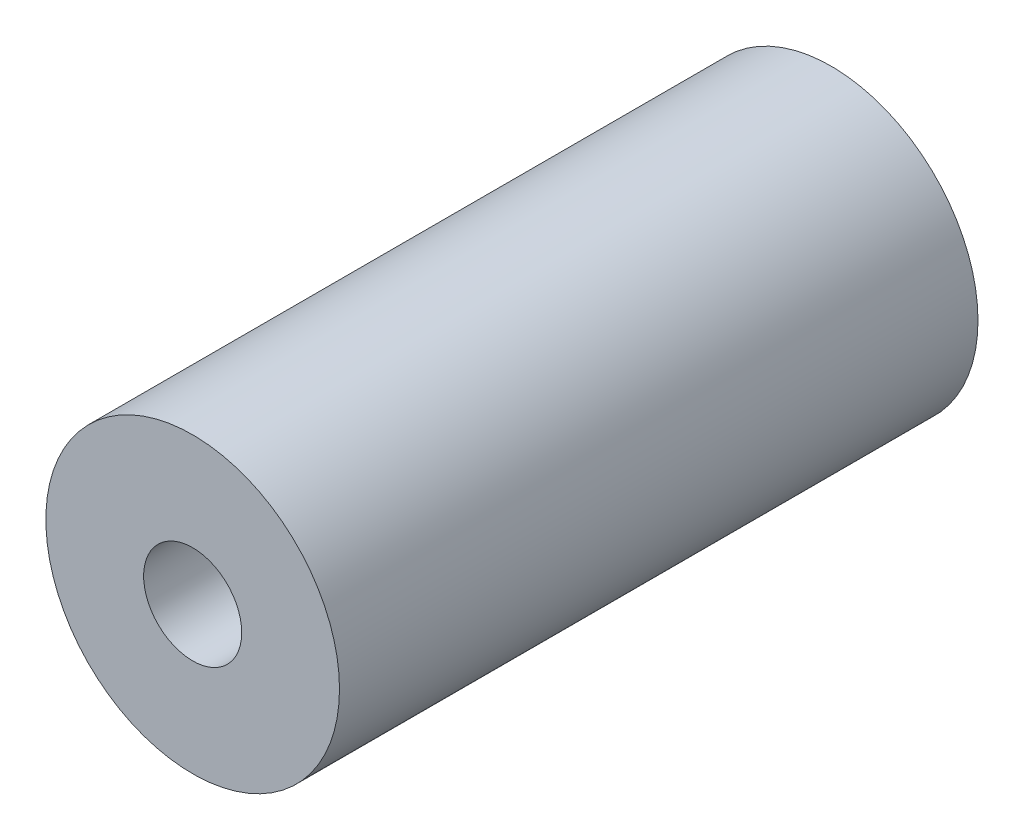
ISO-10303-21;
HEADER;
FILE_DESCRIPTION(('STEP AP214'),'2;1');
FILE_NAME('part.step','',(''),(''),'','','');
FILE_SCHEMA(('AUTOMOTIVE_DESIGN { 1 0 10303 214 1 1 1 1 }'));
ENDSEC;
DATA;
#1=APPLICATION_CONTEXT('core data for automotive mechanical design processes');
#2=APPLICATION_PROTOCOL_DEFINITION('international standard','automotive_design',2000,#1);
#3=PRODUCT_CONTEXT('',#1,'mechanical');
#4=PRODUCT('Part','Part','',(#3));
#5=PRODUCT_RELATED_PRODUCT_CATEGORY('part','',(#4));
#6=PRODUCT_DEFINITION_FORMATION('','',#4);
#7=PRODUCT_DEFINITION_CONTEXT('part definition',#1,'design');
#8=PRODUCT_DEFINITION('design','',#6,#7);
#9=PRODUCT_DEFINITION_SHAPE('','',#8);
#10=(LENGTH_UNIT() NAMED_UNIT(*) SI_UNIT(.MILLI.,.METRE.));
#11=(NAMED_UNIT(*) PLANE_ANGLE_UNIT() SI_UNIT($,.RADIAN.));
#12=(NAMED_UNIT(*) SI_UNIT($,.STERADIAN.) SOLID_ANGLE_UNIT());
#13=UNCERTAINTY_MEASURE_WITH_UNIT(LENGTH_MEASURE(1.E-05),#10,'distance_accuracy_value','');
#14=(GEOMETRIC_REPRESENTATION_CONTEXT(3) GLOBAL_UNCERTAINTY_ASSIGNED_CONTEXT((#13)) GLOBAL_UNIT_ASSIGNED_CONTEXT((#10,
#11,#12)) REPRESENTATION_CONTEXT('',''));
#15=CARTESIAN_POINT('',(0.,0.,0.));
#16=DIRECTION('',(0.,0.,1.));
#17=DIRECTION('',(1.,0.,0.));
#18=AXIS2_PLACEMENT_3D('',#15,#16,#17);
#19=CARTESIAN_POINT('',(0.,0.,20.7));
#20=DIRECTION('',(0.,0.,1.));
#21=DIRECTION('',(1.,0.,0.));
#22=AXIS2_PLACEMENT_3D('',#19,#20,#21);
#23=PLANE('',#22);
#24=CARTESIAN_POINT('',(0.,0.,20.7));
#25=DIRECTION('',(0.,0.,1.));
#26=DIRECTION('',(1.,0.,0.));
#27=AXIS2_PLACEMENT_3D('',#24,#25,#26);
#28=CIRCLE('',#27,4.76);
#29=CARTESIAN_POINT('',(4.76,0.,20.7));
#30=VERTEX_POINT('',#29);
#31=EDGE_CURVE('E10',#30,#30,#28,.T.);
#32=ORIENTED_EDGE('',*,*,#31,.T.);
#33=EDGE_LOOP('',(#32));
#34=FACE_BOUND('',#33,.T.);
#35=CARTESIAN_POINT('',(0.,0.,20.7));
#36=DIRECTION('',(0.,0.,1.));
#37=DIRECTION('',(1.,0.,0.));
#38=AXIS2_PLACEMENT_3D('',#35,#36,#37);
#39=CIRCLE('',#38,1.59);
#40=CARTESIAN_POINT('',(1.59,0.,20.7));
#41=VERTEX_POINT('',#40);
#42=EDGE_CURVE('E26',#41,#41,#39,.T.);
#43=ORIENTED_EDGE('',*,*,#42,.F.);
#44=EDGE_LOOP('',(#43));
#45=FACE_BOUND('',#44,.T.);
#46=ADVANCED_FACE('F15',(#34,#45),#23,.T.);
#47=CARTESIAN_POINT('',(0.,0.,0.));
#48=DIRECTION('',(0.,0.,1.));
#49=DIRECTION('',(1.,0.,0.));
#50=AXIS2_PLACEMENT_3D('',#47,#48,#49);
#51=PLANE('',#50);
#52=CARTESIAN_POINT('',(0.,0.,0.));
#53=DIRECTION('',(0.,0.,1.));
#54=DIRECTION('',(1.,0.,0.));
#55=AXIS2_PLACEMENT_3D('',#52,#53,#54);
#56=CIRCLE('',#55,4.76);
#57=CARTESIAN_POINT('',(4.76,0.,0.));
#58=VERTEX_POINT('',#57);
#59=EDGE_CURVE('E19',#58,#58,#56,.T.);
#60=ORIENTED_EDGE('',*,*,#59,.F.);
#61=EDGE_LOOP('',(#60));
#62=FACE_BOUND('',#61,.T.);
#63=CARTESIAN_POINT('',(0.,0.,0.));
#64=DIRECTION('',(0.,0.,1.));
#65=DIRECTION('',(1.,0.,0.));
#66=AXIS2_PLACEMENT_3D('',#63,#64,#65);
#67=CIRCLE('',#66,1.59);
#68=CARTESIAN_POINT('',(1.59,0.,0.));
#69=VERTEX_POINT('',#68);
#70=EDGE_CURVE('E28',#69,#69,#67,.T.);
#71=ORIENTED_EDGE('',*,*,#70,.T.);
#72=EDGE_LOOP('',(#71));
#73=FACE_BOUND('',#72,.T.);
#74=ADVANCED_FACE('F38',(#62,#73),#51,.F.);
#75=CARTESIAN_POINT('',(0.,0.,20.7));
#76=DIRECTION('',(0.,0.,-1.));
#77=DIRECTION('',(-1.,0.,0.));
#78=AXIS2_PLACEMENT_3D('',#75,#76,#77);
#79=CYLINDRICAL_SURFACE('',#78,4.76);
#80=ORIENTED_EDGE('',*,*,#31,.F.);
#81=EDGE_LOOP('',(#80));
#82=FACE_BOUND('',#81,.T.);
#83=ORIENTED_EDGE('',*,*,#59,.T.);
#84=EDGE_LOOP('',(#83));
#85=FACE_BOUND('',#84,.T.);
#86=ADVANCED_FACE('F17',(#82,#85),#79,.T.);
#87=CARTESIAN_POINT('',(0.,0.,20.7));
#88=DIRECTION('',(0.,0.,-1.));
#89=DIRECTION('',(-1.,0.,0.));
#90=AXIS2_PLACEMENT_3D('',#87,#88,#89);
#91=CYLINDRICAL_SURFACE('',#90,1.59);
#92=ORIENTED_EDGE('',*,*,#42,.T.);
#93=EDGE_LOOP('',(#92));
#94=FACE_BOUND('',#93,.T.);
#95=ORIENTED_EDGE('',*,*,#70,.F.);
#96=EDGE_LOOP('',(#95));
#97=FACE_BOUND('',#96,.T.);
#98=ADVANCED_FACE('F34',(#94,#97),#91,.F.);
#99=CLOSED_SHELL('',(#46,#74,#86,#98));
#100=MANIFOLD_SOLID_BREP('B1',#99);
#101=ADVANCED_BREP_SHAPE_REPRESENTATION('',(#18,#100),#14);
#102=SHAPE_DEFINITION_REPRESENTATION(#9,#101);
ENDSEC;
END-ISO-10303-21;
